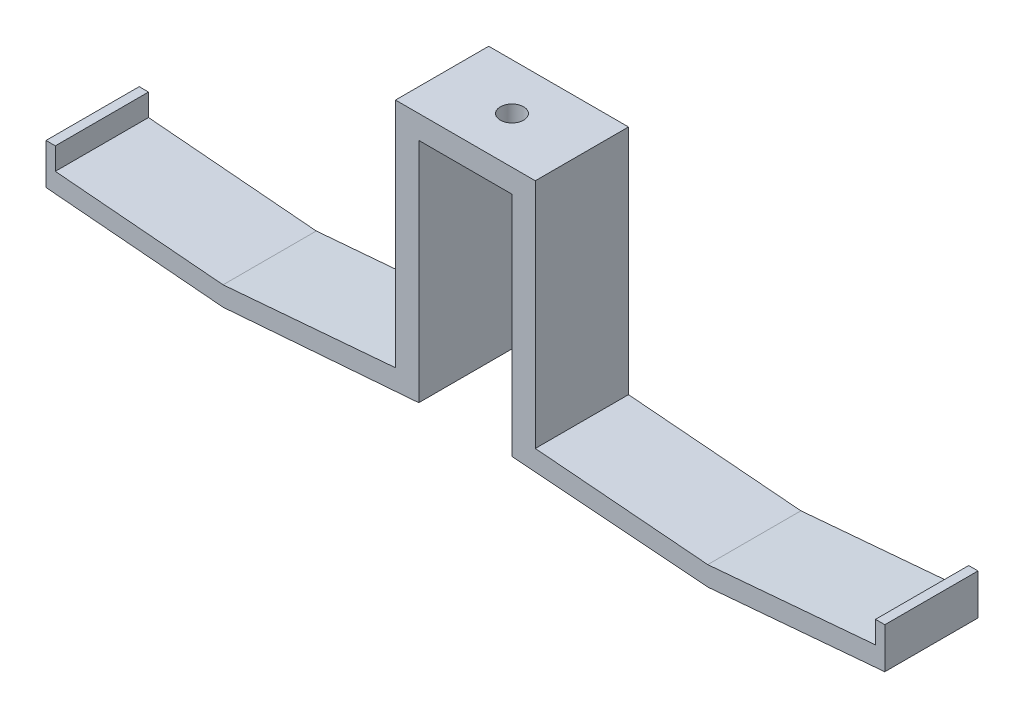
ISO-10303-21;
HEADER;
FILE_DESCRIPTION(('STEP AP214'),'2;1');
FILE_NAME('part.step','',(''),(''),'','','');
FILE_SCHEMA(('AUTOMOTIVE_DESIGN { 1 0 10303 214 1 1 1 1 }'));
ENDSEC;
DATA;
#1=APPLICATION_CONTEXT('core data for automotive mechanical design processes');
#2=APPLICATION_PROTOCOL_DEFINITION('international standard','automotive_design',2000,#1);
#3=PRODUCT_CONTEXT('',#1,'mechanical');
#4=PRODUCT('Part','Part','',(#3));
#5=PRODUCT_RELATED_PRODUCT_CATEGORY('part','',(#4));
#6=PRODUCT_DEFINITION_FORMATION('','',#4);
#7=PRODUCT_DEFINITION_CONTEXT('part definition',#1,'design');
#8=PRODUCT_DEFINITION('design','',#6,#7);
#9=PRODUCT_DEFINITION_SHAPE('','',#8);
#10=(LENGTH_UNIT() NAMED_UNIT(*) SI_UNIT(.MILLI.,.METRE.));
#11=(NAMED_UNIT(*) PLANE_ANGLE_UNIT() SI_UNIT($,.RADIAN.));
#12=(NAMED_UNIT(*) SI_UNIT($,.STERADIAN.) SOLID_ANGLE_UNIT());
#13=UNCERTAINTY_MEASURE_WITH_UNIT(LENGTH_MEASURE(1.E-05),#10,'distance_accuracy_value','');
#14=(GEOMETRIC_REPRESENTATION_CONTEXT(3) GLOBAL_UNCERTAINTY_ASSIGNED_CONTEXT((#13)) GLOBAL_UNIT_ASSIGNED_CONTEXT((#10,
#11,#12)) REPRESENTATION_CONTEXT('',''));
#15=CARTESIAN_POINT('',(0.,0.,0.));
#16=DIRECTION('',(0.,0.,1.));
#17=DIRECTION('',(1.,0.,0.));
#18=AXIS2_PLACEMENT_3D('',#15,#16,#17);
#19=CARTESIAN_POINT('',(-4.57245309052163,-54.8694358998936,25.4));
#20=DIRECTION('',(0.0830454816369344,0.99654575809628,0.));
#21=DIRECTION('',(-0.99654575809628,0.0830454816369344,0.));
#22=AXIS2_PLACEMENT_3D('',#19,#20,#21);
#23=PLANE('',#22);
#24=DIRECTION('',(0.99654575809628,-0.0830454816369344,0.));
#25=VECTOR('',#24,1.);
#26=CARTESIAN_POINT('',(-4.57245309052163,-54.8694358998936,0.));
#27=LINE('',#26,#25);
#28=CARTESIAN_POINT('',(19.05,-56.8379737,0.));
#29=VERTEX_POINT('',#28);
#30=CARTESIAN_POINT('',(66.04,-60.753807118,0.));
#31=VERTEX_POINT('',#30);
#32=EDGE_CURVE('E202',#29,#31,#27,.T.);
#33=ORIENTED_EDGE('',*,*,#32,.F.);
#34=DIRECTION('',(0.,0.,-1.));
#35=VECTOR('',#34,1.);
#36=CARTESIAN_POINT('',(19.05,-56.8379737,25.4));
#37=LINE('',#36,#35);
#38=CARTESIAN_POINT('',(19.05,-56.8379737,25.4));
#39=VERTEX_POINT('',#38);
#40=EDGE_CURVE('E11',#39,#29,#37,.T.);
#41=ORIENTED_EDGE('',*,*,#40,.F.);
#42=DIRECTION('',(0.99654575809628,-0.0830454816369344,0.));
#43=VECTOR('',#42,1.);
#44=CARTESIAN_POINT('',(-4.57245309052163,-54.8694358998936,25.4));
#45=LINE('',#44,#43);
#46=CARTESIAN_POINT('',(66.04,-60.753807118,25.4));
#47=VERTEX_POINT('',#46);
#48=EDGE_CURVE('E251',#39,#47,#45,.T.);
#49=ORIENTED_EDGE('',*,*,#48,.T.);
#50=DIRECTION('',(0.,0.,-1.));
#51=VECTOR('',#50,1.);
#52=CARTESIAN_POINT('',(66.04,-60.753807118,25.4));
#53=LINE('',#52,#51);
#54=EDGE_CURVE('E125',#47,#31,#53,.T.);
#55=ORIENTED_EDGE('',*,*,#54,.T.);
#56=EDGE_LOOP('',(#33,#41,#49,#55));
#57=FACE_BOUND('',#56,.T.);
#58=ADVANCED_FACE('F37',(#57),#23,.T.);
#59=CARTESIAN_POINT('',(19.05,0.,25.4));
#60=DIRECTION('',(1.,0.,0.));
#61=DIRECTION('',(0.,1.,0.));
#62=AXIS2_PLACEMENT_3D('',#59,#60,#61);
#63=PLANE('',#62);
#64=DIRECTION('',(0.,-1.,0.));
#65=VECTOR('',#64,1.);
#66=CARTESIAN_POINT('',(19.05,0.,0.));
#67=LINE('',#66,#65);
#68=CARTESIAN_POINT('',(19.05,6.34999999999999,0.));
#69=VERTEX_POINT('',#68);
#70=EDGE_CURVE('E205',#69,#29,#67,.T.);
#71=ORIENTED_EDGE('',*,*,#70,.F.);
#72=DIRECTION('',(0.,0.,-1.));
#73=VECTOR('',#72,1.);
#74=CARTESIAN_POINT('',(19.05,6.34999999999999,25.4));
#75=LINE('',#74,#73);
#76=CARTESIAN_POINT('',(19.05,6.34999999999999,25.4));
#77=VERTEX_POINT('',#76);
#78=EDGE_CURVE('E46',#77,#69,#75,.T.);
#79=ORIENTED_EDGE('',*,*,#78,.F.);
#80=DIRECTION('',(0.,-1.,0.));
#81=VECTOR('',#80,1.);
#82=CARTESIAN_POINT('',(19.05,0.,25.4));
#83=LINE('',#82,#81);
#84=EDGE_CURVE('E303',#77,#39,#83,.T.);
#85=ORIENTED_EDGE('',*,*,#84,.T.);
#86=ORIENTED_EDGE('',*,*,#40,.T.);
#87=EDGE_LOOP('',(#71,#79,#85,#86));
#88=FACE_BOUND('',#87,.T.);
#89=ADVANCED_FACE('F302',(#88),#63,.T.);
#90=CARTESIAN_POINT('',(0.,6.34999999999999,25.4));
#91=DIRECTION('',(0.,-1.,0.));
#92=DIRECTION('',(0.,0.,-1.));
#93=AXIS2_PLACEMENT_3D('',#90,#91,#92);
#94=PLANE('',#93);
#95=CARTESIAN_POINT('',(0.,6.34999999999999,12.7));
#96=DIRECTION('',(0.,1.,0.));
#97=DIRECTION('',(0.,0.,1.));
#98=AXIS2_PLACEMENT_3D('',#95,#96,#97);
#99=CIRCLE('',#98,3.175);
#100=CARTESIAN_POINT('',(0.,6.34999999999999,15.875));
#101=VERTEX_POINT('',#100);
#102=EDGE_CURVE('E310',#101,#101,#99,.T.);
#103=ORIENTED_EDGE('',*,*,#102,.F.);
#104=EDGE_LOOP('',(#103));
#105=FACE_BOUND('',#104,.T.);
#106=DIRECTION('',(-1.,0.,0.));
#107=VECTOR('',#106,1.);
#108=CARTESIAN_POINT('',(0.,6.34999999999999,0.));
#109=LINE('',#108,#107);
#110=CARTESIAN_POINT('',(-19.05,6.34999999999999,0.));
#111=VERTEX_POINT('',#110);
#112=EDGE_CURVE('E208',#69,#111,#109,.T.);
#113=ORIENTED_EDGE('',*,*,#112,.T.);
#114=DIRECTION('',(0.,0.,-1.));
#115=VECTOR('',#114,1.);
#116=CARTESIAN_POINT('',(-19.05,6.34999999999999,25.4));
#117=LINE('',#116,#115);
#118=CARTESIAN_POINT('',(-19.05,6.34999999999999,25.4));
#119=VERTEX_POINT('',#118);
#120=EDGE_CURVE('E285',#119,#111,#117,.T.);
#121=ORIENTED_EDGE('',*,*,#120,.F.);
#122=DIRECTION('',(-1.,0.,0.));
#123=VECTOR('',#122,1.);
#124=CARTESIAN_POINT('',(0.,6.34999999999999,25.4));
#125=LINE('',#124,#123);
#126=EDGE_CURVE('E293',#77,#119,#125,.T.);
#127=ORIENTED_EDGE('',*,*,#126,.F.);
#128=ORIENTED_EDGE('',*,*,#78,.T.);
#129=EDGE_LOOP('',(#113,#121,#127,#128));
#130=FACE_BOUND('',#129,.T.);
#131=ADVANCED_FACE('F291',(#105,#130),#94,.F.);
#132=CARTESIAN_POINT('',(-19.05,0.,25.4));
#133=DIRECTION('',(1.,0.,0.));
#134=DIRECTION('',(0.,1.,0.));
#135=AXIS2_PLACEMENT_3D('',#132,#133,#134);
#136=PLANE('',#135);
#137=DIRECTION('',(0.,-1.,0.));
#138=VECTOR('',#137,1.);
#139=CARTESIAN_POINT('',(-19.05,0.,0.));
#140=LINE('',#139,#138);
#141=CARTESIAN_POINT('',(-19.05,-56.8379737,0.));
#142=VERTEX_POINT('',#141);
#143=EDGE_CURVE('E210',#111,#142,#140,.T.);
#144=ORIENTED_EDGE('',*,*,#143,.T.);
#145=DIRECTION('',(0.,0.,-1.));
#146=VECTOR('',#145,1.);
#147=CARTESIAN_POINT('',(-19.05,-56.8379737,25.4));
#148=LINE('',#147,#146);
#149=CARTESIAN_POINT('',(-19.05,-56.8379737,25.4));
#150=VERTEX_POINT('',#149);
#151=EDGE_CURVE('E282',#150,#142,#148,.T.);
#152=ORIENTED_EDGE('',*,*,#151,.F.);
#153=DIRECTION('',(0.,-1.,0.));
#154=VECTOR('',#153,1.);
#155=CARTESIAN_POINT('',(-19.05,0.,25.4));
#156=LINE('',#155,#154);
#157=EDGE_CURVE('E313',#119,#150,#156,.T.);
#158=ORIENTED_EDGE('',*,*,#157,.F.);
#159=ORIENTED_EDGE('',*,*,#120,.T.);
#160=EDGE_LOOP('',(#144,#152,#158,#159));
#161=FACE_BOUND('',#160,.T.);
#162=ADVANCED_FACE('F403',(#161),#136,.F.);
#163=CARTESIAN_POINT('',(4.57245309052164,-54.8694358998936,25.4));
#164=DIRECTION('',(0.0830454816369345,-0.99654575809628,0.));
#165=DIRECTION('',(0.99654575809628,0.0830454816369345,0.));
#166=AXIS2_PLACEMENT_3D('',#163,#164,#165);
#167=PLANE('',#166);
#168=DIRECTION('',(-0.99654575809628,-0.0830454816369345,0.));
#169=VECTOR('',#168,1.);
#170=CARTESIAN_POINT('',(4.57245309052164,-54.8694358998936,0.));
#171=LINE('',#170,#169);
#172=CARTESIAN_POINT('',(-66.04,-60.753807118,0.));
#173=VERTEX_POINT('',#172);
#174=EDGE_CURVE('E212',#142,#173,#171,.T.);
#175=ORIENTED_EDGE('',*,*,#174,.T.);
#176=DIRECTION('',(0.,0.,-1.));
#177=VECTOR('',#176,1.);
#178=CARTESIAN_POINT('',(-66.04,-60.753807118,25.4));
#179=LINE('',#178,#177);
#180=CARTESIAN_POINT('',(-66.04,-60.753807118,25.4));
#181=VERTEX_POINT('',#180);
#182=EDGE_CURVE('E280',#181,#173,#179,.T.);
#183=ORIENTED_EDGE('',*,*,#182,.F.);
#184=DIRECTION('',(-0.99654575809628,-0.0830454816369345,0.));
#185=VECTOR('',#184,1.);
#186=CARTESIAN_POINT('',(4.57245309052164,-54.8694358998936,25.4));
#187=LINE('',#186,#185);
#188=EDGE_CURVE('E315',#150,#181,#187,.T.);
#189=ORIENTED_EDGE('',*,*,#188,.F.);
#190=ORIENTED_EDGE('',*,*,#151,.T.);
#191=EDGE_LOOP('',(#175,#183,#189,#190));
#192=FACE_BOUND('',#191,.T.);
#193=ADVANCED_FACE('F399',(#192),#167,.F.);
#194=CARTESIAN_POINT('',(-5.64647427056283,-65.9264008687037,25.4));
#195=DIRECTION('',(0.0853357272861369,0.996352253798096,0.));
#196=DIRECTION('',(-0.996352253798096,0.0853357272861369,0.));
#197=AXIS2_PLACEMENT_3D('',#194,#195,#196);
#198=PLANE('',#197);
#199=DIRECTION('',(0.996352253798096,-0.0853357272861369,0.));
#200=VECTOR('',#199,1.);
#201=CARTESIAN_POINT('',(-5.64647427056283,-65.9264008687037,0.));
#202=LINE('',#201,#200);
#203=CARTESIAN_POINT('',(-111.76,-56.8379737,0.));
#204=VERTEX_POINT('',#203);
#205=EDGE_CURVE('E215',#204,#173,#202,.T.);
#206=ORIENTED_EDGE('',*,*,#205,.F.);
#207=DIRECTION('',(0.,0.,-1.));
#208=VECTOR('',#207,1.);
#209=CARTESIAN_POINT('',(-111.76,-56.8379737,25.4));
#210=LINE('',#209,#208);
#211=CARTESIAN_POINT('',(-111.76,-56.8379737,25.4));
#212=VERTEX_POINT('',#211);
#213=EDGE_CURVE('E278',#212,#204,#210,.T.);
#214=ORIENTED_EDGE('',*,*,#213,.F.);
#215=DIRECTION('',(0.996352253798096,-0.0853357272861369,0.));
#216=VECTOR('',#215,1.);
#217=CARTESIAN_POINT('',(-5.64647427056283,-65.9264008687037,25.4));
#218=LINE('',#217,#216);
#219=EDGE_CURVE('E317',#212,#181,#218,.T.);
#220=ORIENTED_EDGE('',*,*,#219,.T.);
#221=ORIENTED_EDGE('',*,*,#182,.T.);
#222=EDGE_LOOP('',(#206,#214,#220,#221));
#223=FACE_BOUND('',#222,.T.);
#224=ADVANCED_FACE('F394',(#223),#198,.T.);
#225=CARTESIAN_POINT('',(-111.76,7.72065349939707E-13,25.4));
#226=DIRECTION('',(1.,0.,0.));
#227=DIRECTION('',(0.,1.,0.));
#228=AXIS2_PLACEMENT_3D('',#225,#226,#227);
#229=PLANE('',#228);
#230=DIRECTION('',(0.,-1.,0.));
#231=VECTOR('',#230,1.);
#232=CARTESIAN_POINT('',(-111.76,7.72065349939707E-13,0.));
#233=LINE('',#232,#231);
#234=CARTESIAN_POINT('',(-111.76,-50.811353419,0.));
#235=VERTEX_POINT('',#234);
#236=EDGE_CURVE('E218',#235,#204,#233,.T.);
#237=ORIENTED_EDGE('',*,*,#236,.F.);
#238=DIRECTION('',(0.,0.,-1.));
#239=VECTOR('',#238,1.);
#240=CARTESIAN_POINT('',(-111.76,-50.811353419,25.4));
#241=LINE('',#240,#239);
#242=CARTESIAN_POINT('',(-111.76,-50.811353419,25.4));
#243=VERTEX_POINT('',#242);
#244=EDGE_CURVE('E276',#243,#235,#241,.T.);
#245=ORIENTED_EDGE('',*,*,#244,.F.);
#246=DIRECTION('',(0.,-1.,0.));
#247=VECTOR('',#246,1.);
#248=CARTESIAN_POINT('',(-111.76,7.72065349939707E-13,25.4));
#249=LINE('',#248,#247);
#250=EDGE_CURVE('E320',#243,#212,#249,.T.);
#251=ORIENTED_EDGE('',*,*,#250,.T.);
#252=ORIENTED_EDGE('',*,*,#213,.T.);
#253=EDGE_LOOP('',(#237,#245,#251,#252));
#254=FACE_BOUND('',#253,.T.);
#255=ADVANCED_FACE('F391',(#254),#229,.T.);
#256=CARTESIAN_POINT('',(0.,-50.811353419,25.4));
#257=DIRECTION('',(0.,1.,0.));
#258=DIRECTION('',(0.,0.,1.));
#259=AXIS2_PLACEMENT_3D('',#256,#257,#258);
#260=PLANE('',#259);
#261=DIRECTION('',(1.,0.,0.));
#262=VECTOR('',#261,1.);
#263=CARTESIAN_POINT('',(0.,-50.811353419,0.));
#264=LINE('',#263,#262);
#265=CARTESIAN_POINT('',(-114.3,-50.811353419,0.));
#266=VERTEX_POINT('',#265);
#267=EDGE_CURVE('E221',#266,#235,#264,.T.);
#268=ORIENTED_EDGE('',*,*,#267,.F.);
#269=DIRECTION('',(0.,0.,-1.));
#270=VECTOR('',#269,1.);
#271=CARTESIAN_POINT('',(-114.3,-50.811353419,25.4));
#272=LINE('',#271,#270);
#273=CARTESIAN_POINT('',(-114.3,-50.811353419,25.4));
#274=VERTEX_POINT('',#273);
#275=EDGE_CURVE('E274',#274,#266,#272,.T.);
#276=ORIENTED_EDGE('',*,*,#275,.F.);
#277=DIRECTION('',(1.,0.,0.));
#278=VECTOR('',#277,1.);
#279=CARTESIAN_POINT('',(0.,-50.811353419,25.4));
#280=LINE('',#279,#278);
#281=EDGE_CURVE('E323',#274,#243,#280,.T.);
#282=ORIENTED_EDGE('',*,*,#281,.T.);
#283=ORIENTED_EDGE('',*,*,#244,.T.);
#284=EDGE_LOOP('',(#268,#276,#282,#283));
#285=FACE_BOUND('',#284,.T.);
#286=ADVANCED_FACE('F387',(#285),#260,.T.);
#287=CARTESIAN_POINT('',(-114.3,4.28455580446935E-13,25.4));
#288=DIRECTION('',(-1.,0.,0.));
#289=DIRECTION('',(0.,-1.,0.));
#290=AXIS2_PLACEMENT_3D('',#287,#288,#289);
#291=PLANE('',#290);
#292=DIRECTION('',(0.,1.,0.));
#293=VECTOR('',#292,1.);
#294=CARTESIAN_POINT('',(-114.3,4.28455580446935E-13,0.));
#295=LINE('',#294,#293);
#296=CARTESIAN_POINT('',(-114.3,-61.9179737,0.));
#297=VERTEX_POINT('',#296);
#298=EDGE_CURVE('E224',#297,#266,#295,.T.);
#299=ORIENTED_EDGE('',*,*,#298,.F.);
#300=DIRECTION('',(0.,0.,-1.));
#301=VECTOR('',#300,1.);
#302=CARTESIAN_POINT('',(-114.3,-61.9179737,25.4));
#303=LINE('',#302,#301);
#304=CARTESIAN_POINT('',(-114.3,-61.9179737,25.4));
#305=VERTEX_POINT('',#304);
#306=EDGE_CURVE('E272',#305,#297,#303,.T.);
#307=ORIENTED_EDGE('',*,*,#306,.F.);
#308=DIRECTION('',(0.,1.,0.));
#309=VECTOR('',#308,1.);
#310=CARTESIAN_POINT('',(-114.3,4.28455580446935E-13,25.4));
#311=LINE('',#310,#309);
#312=EDGE_CURVE('E326',#305,#274,#311,.T.);
#313=ORIENTED_EDGE('',*,*,#312,.T.);
#314=ORIENTED_EDGE('',*,*,#275,.T.);
#315=EDGE_LOOP('',(#299,#307,#313,#314));
#316=FACE_BOUND('',#315,.T.);
#317=ADVANCED_FACE('F383',(#316),#291,.T.);
#318=CARTESIAN_POINT('',(-6.09689520048762,-71.1853694503343,25.4));
#319=DIRECTION('',(-0.0853357272861369,-0.996352253798096,0.));
#320=DIRECTION('',(0.996352253798096,-0.0853357272861369,0.));
#321=AXIS2_PLACEMENT_3D('',#318,#319,#320);
#322=PLANE('',#321);
#323=DIRECTION('',(-0.996352253798096,0.0853357272861369,0.));
#324=VECTOR('',#323,1.);
#325=CARTESIAN_POINT('',(-6.09689520048762,-71.1853694503343,0.));
#326=LINE('',#325,#324);
#327=CARTESIAN_POINT('',(-66.04,-66.051353419,0.));
#328=VERTEX_POINT('',#327);
#329=EDGE_CURVE('E227',#328,#297,#326,.T.);
#330=ORIENTED_EDGE('',*,*,#329,.F.);
#331=DIRECTION('',(0.,0.,-1.));
#332=VECTOR('',#331,1.);
#333=CARTESIAN_POINT('',(-66.04,-66.051353419,25.4));
#334=LINE('',#333,#332);
#335=CARTESIAN_POINT('',(-66.04,-66.051353419,25.4));
#336=VERTEX_POINT('',#335);
#337=EDGE_CURVE('E270',#336,#328,#334,.T.);
#338=ORIENTED_EDGE('',*,*,#337,.F.);
#339=DIRECTION('',(-0.996352253798096,0.0853357272861369,0.));
#340=VECTOR('',#339,1.);
#341=CARTESIAN_POINT('',(-6.09689520048762,-71.1853694503343,25.4));
#342=LINE('',#341,#340);
#343=EDGE_CURVE('E329',#336,#305,#342,.T.);
#344=ORIENTED_EDGE('',*,*,#343,.T.);
#345=ORIENTED_EDGE('',*,*,#306,.T.);
#346=EDGE_LOOP('',(#330,#338,#344,#345));
#347=FACE_BOUND('',#346,.T.);
#348=ADVANCED_FACE('F379',(#347),#322,.T.);
#349=CARTESIAN_POINT('',(4.69365020857041,-60.5701191628518,25.4));
#350=DIRECTION('',(0.0772595631880117,-0.997011012926135,0.));
#351=DIRECTION('',(0.997011012926135,0.0772595631880117,0.));
#352=AXIS2_PLACEMENT_3D('',#349,#350,#351);
#353=PLANE('',#352);
#354=DIRECTION('',(-0.997011012926135,-0.0772595631880117,0.));
#355=VECTOR('',#354,1.);
#356=CARTESIAN_POINT('',(4.69365020857041,-60.5701191628518,0.));
#357=LINE('',#356,#355);
#358=CARTESIAN_POINT('',(-12.7,-61.9179737,0.));
#359=VERTEX_POINT('',#358);
#360=EDGE_CURVE('E230',#359,#328,#357,.T.);
#361=ORIENTED_EDGE('',*,*,#360,.F.);
#362=DIRECTION('',(0.,0.,-1.));
#363=VECTOR('',#362,1.);
#364=CARTESIAN_POINT('',(-12.7,-61.9179737,25.4));
#365=LINE('',#364,#363);
#366=CARTESIAN_POINT('',(-12.7,-61.9179737,25.4));
#367=VERTEX_POINT('',#366);
#368=EDGE_CURVE('E268',#367,#359,#365,.T.);
#369=ORIENTED_EDGE('',*,*,#368,.F.);
#370=DIRECTION('',(-0.997011012926135,-0.0772595631880117,0.));
#371=VECTOR('',#370,1.);
#372=CARTESIAN_POINT('',(4.69365020857041,-60.5701191628518,25.4));
#373=LINE('',#372,#371);
#374=EDGE_CURVE('E332',#367,#336,#373,.T.);
#375=ORIENTED_EDGE('',*,*,#374,.T.);
#376=ORIENTED_EDGE('',*,*,#337,.T.);
#377=EDGE_LOOP('',(#361,#369,#375,#376));
#378=FACE_BOUND('',#377,.T.);
#379=ADVANCED_FACE('F375',(#378),#353,.T.);
#380=CARTESIAN_POINT('',(-12.7,0.,25.4));
#381=DIRECTION('',(1.,0.,0.));
#382=DIRECTION('',(0.,1.,0.));
#383=AXIS2_PLACEMENT_3D('',#380,#381,#382);
#384=PLANE('',#383);
#385=DIRECTION('',(0.,-1.,0.));
#386=VECTOR('',#385,1.);
#387=CARTESIAN_POINT('',(-12.7,0.,0.));
#388=LINE('',#387,#386);
#389=CARTESIAN_POINT('',(-12.7,0.,0.));
#390=VERTEX_POINT('',#389);
#391=EDGE_CURVE('E233',#390,#359,#388,.T.);
#392=ORIENTED_EDGE('',*,*,#391,.F.);
#393=DIRECTION('',(0.,0.,-1.));
#394=VECTOR('',#393,1.);
#395=CARTESIAN_POINT('',(-12.7,0.,25.4));
#396=LINE('',#395,#394);
#397=CARTESIAN_POINT('',(-12.7,0.,25.4));
#398=VERTEX_POINT('',#397);
#399=EDGE_CURVE('E266',#398,#390,#396,.T.);
#400=ORIENTED_EDGE('',*,*,#399,.F.);
#401=DIRECTION('',(0.,-1.,0.));
#402=VECTOR('',#401,1.);
#403=CARTESIAN_POINT('',(-12.7,0.,25.4));
#404=LINE('',#403,#402);
#405=EDGE_CURVE('E335',#398,#367,#404,.T.);
#406=ORIENTED_EDGE('',*,*,#405,.T.);
#407=ORIENTED_EDGE('',*,*,#368,.T.);
#408=EDGE_LOOP('',(#392,#400,#406,#407));
#409=FACE_BOUND('',#408,.T.);
#410=ADVANCED_FACE('F371',(#409),#384,.T.);
#411=CARTESIAN_POINT('',(0.,0.,25.4));
#412=DIRECTION('',(0.,-1.,0.));
#413=DIRECTION('',(0.,0.,-1.));
#414=AXIS2_PLACEMENT_3D('',#411,#412,#413);
#415=PLANE('',#414);
#416=CARTESIAN_POINT('',(0.,0.,12.7));
#417=DIRECTION('',(0.,-1.,0.));
#418=DIRECTION('',(0.,0.,-1.));
#419=AXIS2_PLACEMENT_3D('',#416,#417,#418);
#420=CIRCLE('',#419,3.17499999999999);
#421=CARTESIAN_POINT('',(0.,0.,9.52500000000001));
#422=VERTEX_POINT('',#421);
#423=EDGE_CURVE('E40',#422,#422,#420,.T.);
#424=ORIENTED_EDGE('',*,*,#423,.F.);
#425=EDGE_LOOP('',(#424));
#426=FACE_BOUND('',#425,.T.);
#427=DIRECTION('',(-1.,0.,0.));
#428=VECTOR('',#427,1.);
#429=CARTESIAN_POINT('',(0.,0.,0.));
#430=LINE('',#429,#428);
#431=CARTESIAN_POINT('',(12.7,0.,0.));
#432=VERTEX_POINT('',#431);
#433=EDGE_CURVE('E236',#432,#390,#430,.T.);
#434=ORIENTED_EDGE('',*,*,#433,.F.);
#435=DIRECTION('',(0.,0.,-1.));
#436=VECTOR('',#435,1.);
#437=CARTESIAN_POINT('',(12.7,0.,25.4));
#438=LINE('',#437,#436);
#439=CARTESIAN_POINT('',(12.7,0.,25.4));
#440=VERTEX_POINT('',#439);
#441=EDGE_CURVE('E264',#440,#432,#438,.T.);
#442=ORIENTED_EDGE('',*,*,#441,.F.);
#443=DIRECTION('',(-1.,0.,0.));
#444=VECTOR('',#443,1.);
#445=CARTESIAN_POINT('',(0.,0.,25.4));
#446=LINE('',#445,#444);
#447=EDGE_CURVE('E338',#440,#398,#446,.T.);
#448=ORIENTED_EDGE('',*,*,#447,.T.);
#449=ORIENTED_EDGE('',*,*,#399,.T.);
#450=EDGE_LOOP('',(#434,#442,#448,#449));
#451=FACE_BOUND('',#450,.T.);
#452=ADVANCED_FACE('F367',(#426,#451),#415,.T.);
#453=CARTESIAN_POINT('',(12.7,0.,25.4));
#454=DIRECTION('',(1.,0.,0.));
#455=DIRECTION('',(0.,1.,0.));
#456=AXIS2_PLACEMENT_3D('',#453,#454,#455);
#457=PLANE('',#456);
#458=DIRECTION('',(0.,-1.,0.));
#459=VECTOR('',#458,1.);
#460=CARTESIAN_POINT('',(12.7,0.,0.));
#461=LINE('',#460,#459);
#462=CARTESIAN_POINT('',(12.7,-61.9179737,0.));
#463=VERTEX_POINT('',#462);
#464=EDGE_CURVE('E239',#432,#463,#461,.T.);
#465=ORIENTED_EDGE('',*,*,#464,.T.);
#466=DIRECTION('',(0.,0.,-1.));
#467=VECTOR('',#466,1.);
#468=CARTESIAN_POINT('',(12.7,-61.9179737,25.4));
#469=LINE('',#468,#467);
#470=CARTESIAN_POINT('',(12.7,-61.9179737,25.4));
#471=VERTEX_POINT('',#470);
#472=EDGE_CURVE('E261',#471,#463,#469,.T.);
#473=ORIENTED_EDGE('',*,*,#472,.F.);
#474=DIRECTION('',(0.,-1.,0.));
#475=VECTOR('',#474,1.);
#476=CARTESIAN_POINT('',(12.7,0.,25.4));
#477=LINE('',#476,#475);
#478=EDGE_CURVE('E341',#440,#471,#477,.T.);
#479=ORIENTED_EDGE('',*,*,#478,.F.);
#480=ORIENTED_EDGE('',*,*,#441,.T.);
#481=EDGE_LOOP('',(#465,#473,#479,#480));
#482=FACE_BOUND('',#481,.T.);
#483=ADVANCED_FACE('F364',(#482),#457,.F.);
#484=CARTESIAN_POINT('',(-4.69365020857039,-60.5701191628518,25.4));
#485=DIRECTION('',(0.0772595631880114,0.997011012926135,0.));
#486=DIRECTION('',(-0.997011012926135,0.0772595631880114,0.));
#487=AXIS2_PLACEMENT_3D('',#484,#485,#486);
#488=PLANE('',#487);
#489=DIRECTION('',(0.997011012926135,-0.0772595631880114,0.));
#490=VECTOR('',#489,1.);
#491=CARTESIAN_POINT('',(-4.69365020857039,-60.5701191628518,0.));
#492=LINE('',#491,#490);
#493=CARTESIAN_POINT('',(66.04,-66.051353419,0.));
#494=VERTEX_POINT('',#493);
#495=EDGE_CURVE('E241',#463,#494,#492,.T.);
#496=ORIENTED_EDGE('',*,*,#495,.T.);
#497=DIRECTION('',(0.,0.,-1.));
#498=VECTOR('',#497,1.);
#499=CARTESIAN_POINT('',(66.04,-66.051353419,25.4));
#500=LINE('',#499,#498);
#501=CARTESIAN_POINT('',(66.04,-66.051353419,25.4));
#502=VERTEX_POINT('',#501);
#503=EDGE_CURVE('E258',#502,#494,#500,.T.);
#504=ORIENTED_EDGE('',*,*,#503,.F.);
#505=DIRECTION('',(0.997011012926135,-0.0772595631880114,0.));
#506=VECTOR('',#505,1.);
#507=CARTESIAN_POINT('',(-4.69365020857039,-60.5701191628518,25.4));
#508=LINE('',#507,#506);
#509=EDGE_CURVE('E343',#471,#502,#508,.T.);
#510=ORIENTED_EDGE('',*,*,#509,.F.);
#511=ORIENTED_EDGE('',*,*,#472,.T.);
#512=EDGE_LOOP('',(#496,#504,#510,#511));
#513=FACE_BOUND('',#512,.T.);
#514=ADVANCED_FACE('F360',(#513),#488,.F.);
#515=CARTESIAN_POINT('',(6.09689520048764,-71.1853694503343,25.4));
#516=DIRECTION('',(-0.0853357272861372,0.996352253798096,0.));
#517=DIRECTION('',(-0.996352253798096,-0.0853357272861372,0.));
#518=AXIS2_PLACEMENT_3D('',#515,#516,#517);
#519=PLANE('',#518);
#520=DIRECTION('',(0.996352253798096,0.0853357272861372,0.));
#521=VECTOR('',#520,1.);
#522=CARTESIAN_POINT('',(6.09689520048764,-71.1853694503343,0.));
#523=LINE('',#522,#521);
#524=CARTESIAN_POINT('',(114.3,-61.9179737,0.));
#525=VERTEX_POINT('',#524);
#526=EDGE_CURVE('E243',#494,#525,#523,.T.);
#527=ORIENTED_EDGE('',*,*,#526,.T.);
#528=DIRECTION('',(0.,0.,-1.));
#529=VECTOR('',#528,1.);
#530=CARTESIAN_POINT('',(114.3,-61.9179737,25.4));
#531=LINE('',#530,#529);
#532=CARTESIAN_POINT('',(114.3,-61.9179737,25.4));
#533=VERTEX_POINT('',#532);
#534=EDGE_CURVE('E255',#533,#525,#531,.T.);
#535=ORIENTED_EDGE('',*,*,#534,.F.);
#536=DIRECTION('',(0.996352253798096,0.0853357272861372,0.));
#537=VECTOR('',#536,1.);
#538=CARTESIAN_POINT('',(6.09689520048764,-71.1853694503343,25.4));
#539=LINE('',#538,#537);
#540=EDGE_CURVE('E345',#502,#533,#539,.T.);
#541=ORIENTED_EDGE('',*,*,#540,.F.);
#542=ORIENTED_EDGE('',*,*,#503,.T.);
#543=EDGE_LOOP('',(#527,#535,#541,#542));
#544=FACE_BOUND('',#543,.T.);
#545=ADVANCED_FACE('F351',(#544),#519,.F.);
#546=CARTESIAN_POINT('',(114.3,1.42818526815645E-13,25.4));
#547=DIRECTION('',(-1.,0.,0.));
#548=DIRECTION('',(0.,-1.,0.));
#549=AXIS2_PLACEMENT_3D('',#546,#547,#548);
#550=PLANE('',#549);
#551=DIRECTION('',(0.,1.,0.));
#552=VECTOR('',#551,1.);
#553=CARTESIAN_POINT('',(114.3,1.42818526815645E-13,0.));
#554=LINE('',#553,#552);
#555=CARTESIAN_POINT('',(114.3,-50.811353419,0.));
#556=VERTEX_POINT('',#555);
#557=EDGE_CURVE('E245',#525,#556,#554,.T.);
#558=ORIENTED_EDGE('',*,*,#557,.T.);
#559=DIRECTION('',(0.,0.,-1.));
#560=VECTOR('',#559,1.);
#561=CARTESIAN_POINT('',(114.3,-50.811353419,25.4));
#562=LINE('',#561,#560);
#563=CARTESIAN_POINT('',(114.3,-50.811353419,25.4));
#564=VERTEX_POINT('',#563);
#565=EDGE_CURVE('E194',#564,#556,#562,.T.);
#566=ORIENTED_EDGE('',*,*,#565,.F.);
#567=DIRECTION('',(0.,1.,0.));
#568=VECTOR('',#567,1.);
#569=CARTESIAN_POINT('',(114.3,1.42818526815645E-13,25.4));
#570=LINE('',#569,#568);
#571=EDGE_CURVE('E185',#533,#564,#570,.T.);
#572=ORIENTED_EDGE('',*,*,#571,.F.);
#573=ORIENTED_EDGE('',*,*,#534,.T.);
#574=EDGE_LOOP('',(#558,#566,#572,#573));
#575=FACE_BOUND('',#574,.T.);
#576=ADVANCED_FACE('F355',(#575),#550,.F.);
#577=CARTESIAN_POINT('',(0.,-50.811353419,25.4));
#578=DIRECTION('',(0.,-1.,0.));
#579=DIRECTION('',(0.,0.,-1.));
#580=AXIS2_PLACEMENT_3D('',#577,#578,#579);
#581=PLANE('',#580);
#582=DIRECTION('',(-1.,0.,0.));
#583=VECTOR('',#582,1.);
#584=CARTESIAN_POINT('',(0.,-50.811353419,0.));
#585=LINE('',#584,#583);
#586=CARTESIAN_POINT('',(111.76,-50.811353419,0.));
#587=VERTEX_POINT('',#586);
#588=EDGE_CURVE('E193',#556,#587,#585,.T.);
#589=ORIENTED_EDGE('',*,*,#588,.T.);
#590=DIRECTION('',(0.,0.,-1.));
#591=VECTOR('',#590,1.);
#592=CARTESIAN_POINT('',(111.76,-50.811353419,25.4));
#593=LINE('',#592,#591);
#594=CARTESIAN_POINT('',(111.76,-50.811353419,25.4));
#595=VERTEX_POINT('',#594);
#596=EDGE_CURVE('E190',#595,#587,#593,.T.);
#597=ORIENTED_EDGE('',*,*,#596,.F.);
#598=DIRECTION('',(-1.,0.,0.));
#599=VECTOR('',#598,1.);
#600=CARTESIAN_POINT('',(0.,-50.811353419,25.4));
#601=LINE('',#600,#599);
#602=EDGE_CURVE('E179',#564,#595,#601,.T.);
#603=ORIENTED_EDGE('',*,*,#602,.F.);
#604=ORIENTED_EDGE('',*,*,#565,.T.);
#605=EDGE_LOOP('',(#589,#597,#603,#604));
#606=FACE_BOUND('',#605,.T.);
#607=ADVANCED_FACE('F191',(#606),#581,.F.);
#608=CARTESIAN_POINT('',(111.76,2.5735511664657E-13,25.4));
#609=DIRECTION('',(1.,0.,0.));
#610=DIRECTION('',(0.,1.,0.));
#611=AXIS2_PLACEMENT_3D('',#608,#609,#610);
#612=PLANE('',#611);
#613=DIRECTION('',(0.,-1.,0.));
#614=VECTOR('',#613,1.);
#615=CARTESIAN_POINT('',(111.76,2.5735511664657E-13,0.));
#616=LINE('',#615,#614);
#617=CARTESIAN_POINT('',(111.76,-56.8379737,0.));
#618=VERTEX_POINT('',#617);
#619=EDGE_CURVE('E118',#587,#618,#616,.T.);
#620=ORIENTED_EDGE('',*,*,#619,.T.);
#621=DIRECTION('',(0.,0.,-1.));
#622=VECTOR('',#621,1.);
#623=CARTESIAN_POINT('',(111.76,-56.8379737,25.4));
#624=LINE('',#623,#622);
#625=CARTESIAN_POINT('',(111.76,-56.8379737,25.4));
#626=VERTEX_POINT('',#625);
#627=EDGE_CURVE('E195',#626,#618,#624,.T.);
#628=ORIENTED_EDGE('',*,*,#627,.F.);
#629=DIRECTION('',(0.,-1.,0.));
#630=VECTOR('',#629,1.);
#631=CARTESIAN_POINT('',(111.76,2.5735511664657E-13,25.4));
#632=LINE('',#631,#630);
#633=EDGE_CURVE('E183',#595,#626,#632,.T.);
#634=ORIENTED_EDGE('',*,*,#633,.F.);
#635=ORIENTED_EDGE('',*,*,#596,.T.);
#636=EDGE_LOOP('',(#620,#628,#634,#635));
#637=FACE_BOUND('',#636,.T.);
#638=ADVANCED_FACE('F197',(#637),#612,.F.);
#639=CARTESIAN_POINT('',(5.64647427056285,-65.9264008687037,25.4));
#640=DIRECTION('',(0.0853357272861372,-0.996352253798096,0.));
#641=DIRECTION('',(0.996352253798096,0.0853357272861372,0.));
#642=AXIS2_PLACEMENT_3D('',#639,#640,#641);
#643=PLANE('',#642);
#644=DIRECTION('',(-0.996352253798096,-0.0853357272861372,0.));
#645=VECTOR('',#644,1.);
#646=CARTESIAN_POINT('',(5.64647427056285,-65.9264008687037,0.));
#647=LINE('',#646,#645);
#648=EDGE_CURVE('E249',#618,#31,#647,.T.);
#649=ORIENTED_EDGE('',*,*,#648,.T.);
#650=ORIENTED_EDGE('',*,*,#54,.F.);
#651=DIRECTION('',(-0.996352253798096,-0.0853357272861372,0.));
#652=VECTOR('',#651,1.);
#653=CARTESIAN_POINT('',(5.64647427056285,-65.9264008687037,25.4));
#654=LINE('',#653,#652);
#655=EDGE_CURVE('E54',#626,#47,#654,.T.);
#656=ORIENTED_EDGE('',*,*,#655,.F.);
#657=ORIENTED_EDGE('',*,*,#627,.T.);
#658=EDGE_LOOP('',(#649,#650,#656,#657));
#659=FACE_BOUND('',#658,.T.);
#660=ADVANCED_FACE('F306',(#659),#643,.F.);
#661=CARTESIAN_POINT('',(0.,0.,25.4));
#662=DIRECTION('',(0.,0.,1.));
#663=DIRECTION('',(1.,0.,0.));
#664=AXIS2_PLACEMENT_3D('',#661,#662,#663);
#665=PLANE('',#664);
#666=ORIENTED_EDGE('',*,*,#48,.F.);
#667=ORIENTED_EDGE('',*,*,#84,.F.);
#668=ORIENTED_EDGE('',*,*,#126,.T.);
#669=ORIENTED_EDGE('',*,*,#157,.T.);
#670=ORIENTED_EDGE('',*,*,#188,.T.);
#671=ORIENTED_EDGE('',*,*,#219,.F.);
#672=ORIENTED_EDGE('',*,*,#250,.F.);
#673=ORIENTED_EDGE('',*,*,#281,.F.);
#674=ORIENTED_EDGE('',*,*,#312,.F.);
#675=ORIENTED_EDGE('',*,*,#343,.F.);
#676=ORIENTED_EDGE('',*,*,#374,.F.);
#677=ORIENTED_EDGE('',*,*,#405,.F.);
#678=ORIENTED_EDGE('',*,*,#447,.F.);
#679=ORIENTED_EDGE('',*,*,#478,.T.);
#680=ORIENTED_EDGE('',*,*,#509,.T.);
#681=ORIENTED_EDGE('',*,*,#540,.T.);
#682=ORIENTED_EDGE('',*,*,#571,.T.);
#683=ORIENTED_EDGE('',*,*,#602,.T.);
#684=ORIENTED_EDGE('',*,*,#633,.T.);
#685=ORIENTED_EDGE('',*,*,#655,.T.);
#686=EDGE_LOOP('',(#666,#667,#668,#669,#670,#671,#672,#673,#674,#675,#676,#677,#678,#679,#680,
#681,#682,#683,#684,#685));
#687=FACE_BOUND('',#686,.T.);
#688=ADVANCED_FACE('F181',(#687),#665,.T.);
#689=CARTESIAN_POINT('',(0.,0.,0.));
#690=DIRECTION('',(0.,0.,1.));
#691=DIRECTION('',(1.,0.,0.));
#692=AXIS2_PLACEMENT_3D('',#689,#690,#691);
#693=PLANE('',#692);
#694=ORIENTED_EDGE('',*,*,#32,.T.);
#695=ORIENTED_EDGE('',*,*,#648,.F.);
#696=ORIENTED_EDGE('',*,*,#619,.F.);
#697=ORIENTED_EDGE('',*,*,#588,.F.);
#698=ORIENTED_EDGE('',*,*,#557,.F.);
#699=ORIENTED_EDGE('',*,*,#526,.F.);
#700=ORIENTED_EDGE('',*,*,#495,.F.);
#701=ORIENTED_EDGE('',*,*,#464,.F.);
#702=ORIENTED_EDGE('',*,*,#433,.T.);
#703=ORIENTED_EDGE('',*,*,#391,.T.);
#704=ORIENTED_EDGE('',*,*,#360,.T.);
#705=ORIENTED_EDGE('',*,*,#329,.T.);
#706=ORIENTED_EDGE('',*,*,#298,.T.);
#707=ORIENTED_EDGE('',*,*,#267,.T.);
#708=ORIENTED_EDGE('',*,*,#236,.T.);
#709=ORIENTED_EDGE('',*,*,#205,.T.);
#710=ORIENTED_EDGE('',*,*,#174,.F.);
#711=ORIENTED_EDGE('',*,*,#143,.F.);
#712=ORIENTED_EDGE('',*,*,#112,.F.);
#713=ORIENTED_EDGE('',*,*,#70,.T.);
#714=EDGE_LOOP('',(#694,#695,#696,#697,#698,#699,#700,#701,#702,#703,#704,#705,#706,#707,#708,
#709,#710,#711,#712,#713));
#715=FACE_BOUND('',#714,.T.);
#716=ADVANCED_FACE('F300',(#715),#693,.F.);
#717=CARTESIAN_POINT('',(0.,6.34999999999999,12.7));
#718=DIRECTION('',(0.,1.,0.));
#719=DIRECTION('',(0.,0.,1.));
#720=AXIS2_PLACEMENT_3D('',#717,#718,#719);
#721=CYLINDRICAL_SURFACE('',#720,3.17499999999999);
#722=ORIENTED_EDGE('',*,*,#423,.T.);
#723=EDGE_LOOP('',(#722));
#724=FACE_BOUND('',#723,.T.);
#725=ORIENTED_EDGE('',*,*,#102,.T.);
#726=EDGE_LOOP('',(#725));
#727=FACE_BOUND('',#726,.T.);
#728=ADVANCED_FACE('F447',(#724,#727),#721,.F.);
#729=CLOSED_SHELL('',(#58,#89,#131,#162,#193,#224,#255,#286,#317,#348,#379,#410,#452,#483,#514,
#545,#576,#607,#638,#660,#688,#716,#728));
#730=MANIFOLD_SOLID_BREP('B2',#729);
#731=ADVANCED_BREP_SHAPE_REPRESENTATION('',(#18,#730),#14);
#732=SHAPE_DEFINITION_REPRESENTATION(#9,#731);
ENDSEC;
END-ISO-10303-21;
